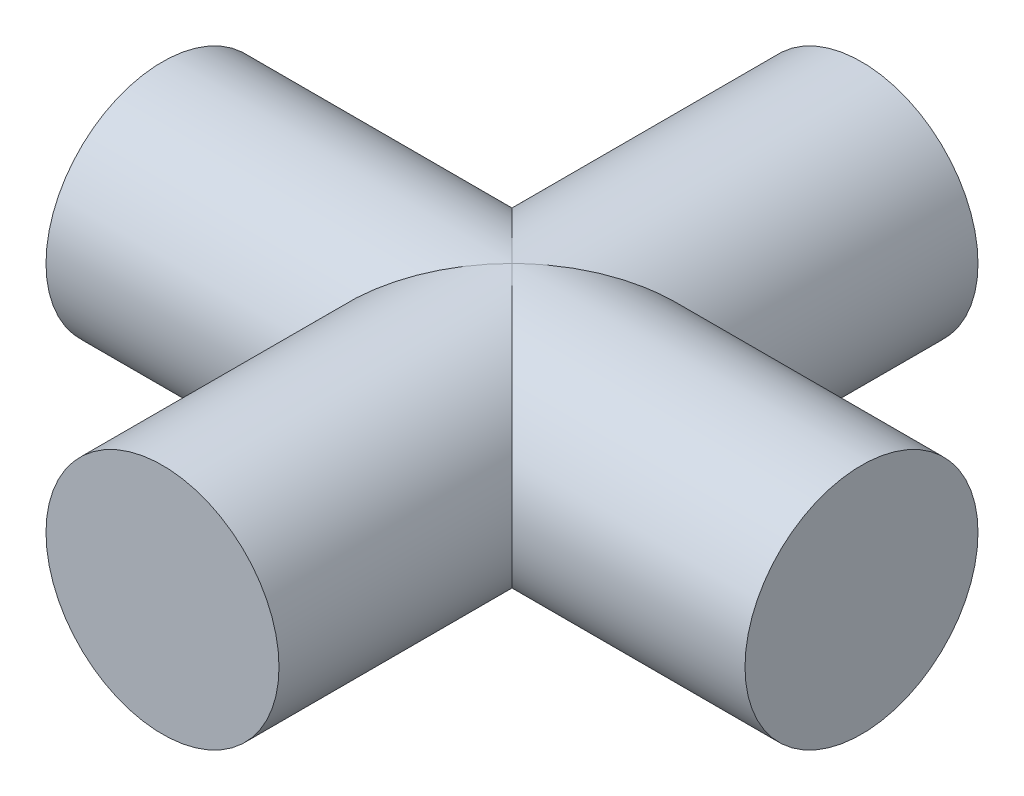
ISO-10303-21;
HEADER;
FILE_DESCRIPTION(('STEP AP214'),'2;1');
FILE_NAME('part.step','',(''),(''),'','','');
FILE_SCHEMA(('AUTOMOTIVE_DESIGN { 1 0 10303 214 1 1 1 1 }'));
ENDSEC;
DATA;
#1=APPLICATION_CONTEXT('core data for automotive mechanical design processes');
#2=APPLICATION_PROTOCOL_DEFINITION('international standard','automotive_design',2000,#1);
#3=PRODUCT_CONTEXT('',#1,'mechanical');
#4=PRODUCT('Part','Part','',(#3));
#5=PRODUCT_RELATED_PRODUCT_CATEGORY('part','',(#4));
#6=PRODUCT_DEFINITION_FORMATION('','',#4);
#7=PRODUCT_DEFINITION_CONTEXT('part definition',#1,'design');
#8=PRODUCT_DEFINITION('design','',#6,#7);
#9=PRODUCT_DEFINITION_SHAPE('','',#8);
#10=(LENGTH_UNIT() NAMED_UNIT(*) SI_UNIT(.MILLI.,.METRE.));
#11=(NAMED_UNIT(*) PLANE_ANGLE_UNIT() SI_UNIT($,.RADIAN.));
#12=(NAMED_UNIT(*) SI_UNIT($,.STERADIAN.) SOLID_ANGLE_UNIT());
#13=UNCERTAINTY_MEASURE_WITH_UNIT(LENGTH_MEASURE(1.E-05),#10,'distance_accuracy_value','');
#14=(GEOMETRIC_REPRESENTATION_CONTEXT(3) GLOBAL_UNCERTAINTY_ASSIGNED_CONTEXT((#13)) GLOBAL_UNIT_ASSIGNED_CONTEXT((#10,
#11,#12)) REPRESENTATION_CONTEXT('',''));
#15=CARTESIAN_POINT('',(0.,0.,0.));
#16=DIRECTION('',(0.,0.,1.));
#17=DIRECTION('',(1.,0.,0.));
#18=AXIS2_PLACEMENT_3D('',#15,#16,#17);
#19=CARTESIAN_POINT('',(0.,0.,-30.));
#20=DIRECTION('',(0.,0.,1.));
#21=DIRECTION('',(1.,0.,0.));
#22=AXIS2_PLACEMENT_3D('',#19,#20,#21);
#23=CYLINDRICAL_SURFACE('',#22,10.);
#24=CARTESIAN_POINT('',(0.,0.,0.));
#25=DIRECTION('',(0.707106781186547,0.,0.707106781186547));
#26=DIRECTION('',(-0.707106781186547,0.,0.707106781186547));
#27=AXIS2_PLACEMENT_3D('',#24,#25,#26);
#28=ELLIPSE('',#27,14.1421356237309,10.);
#29=CARTESIAN_POINT('',(0.,-10.,0.));
#30=VERTEX_POINT('',#29);
#31=CARTESIAN_POINT('',(0.,10.,0.));
#32=VERTEX_POINT('',#31);
#33=EDGE_CURVE('E47',#30,#32,#28,.T.);
#34=ORIENTED_EDGE('',*,*,#33,.F.);
#35=CARTESIAN_POINT('',(0.,0.,0.));
#36=DIRECTION('',(-0.707106781186547,0.,0.707106781186547));
#37=DIRECTION('',(0.707106781186547,0.,0.707106781186547));
#38=AXIS2_PLACEMENT_3D('',#35,#36,#37);
#39=ELLIPSE('',#38,14.1421356237309,10.);
#40=EDGE_CURVE('E59',#32,#30,#39,.T.);
#41=ORIENTED_EDGE('',*,*,#40,.F.);
#42=EDGE_LOOP('',(#34,#41));
#43=FACE_BOUND('',#42,.T.);
#44=CARTESIAN_POINT('',(0.,0.,-30.));
#45=DIRECTION('',(0.,0.,1.));
#46=DIRECTION('',(1.,0.,0.));
#47=AXIS2_PLACEMENT_3D('',#44,#45,#46);
#48=CIRCLE('',#47,10.);
#49=CARTESIAN_POINT('',(10.,0.,-30.));
#50=VERTEX_POINT('',#49);
#51=EDGE_CURVE('E68',#50,#50,#48,.T.);
#52=ORIENTED_EDGE('',*,*,#51,.T.);
#53=EDGE_LOOP('',(#52));
#54=FACE_BOUND('',#53,.T.);
#55=ADVANCED_FACE('F39',(#43,#54),#23,.T.);
#56=CARTESIAN_POINT('',(0.,0.,-30.));
#57=DIRECTION('',(0.,0.,1.));
#58=DIRECTION('',(1.,0.,0.));
#59=AXIS2_PLACEMENT_3D('',#56,#57,#58);
#60=PLANE('',#59);
#61=ORIENTED_EDGE('',*,*,#51,.F.);
#62=EDGE_LOOP('',(#61));
#63=FACE_BOUND('',#62,.T.);
#64=ADVANCED_FACE('F96',(#63),#60,.F.);
#65=CARTESIAN_POINT('',(30.,0.,0.));
#66=DIRECTION('',(1.,0.,0.));
#67=DIRECTION('',(0.,0.,-1.));
#68=AXIS2_PLACEMENT_3D('',#65,#66,#67);
#69=PLANE('',#68);
#70=CARTESIAN_POINT('',(30.,0.,0.));
#71=DIRECTION('',(1.,0.,0.));
#72=DIRECTION('',(0.,0.,-1.));
#73=AXIS2_PLACEMENT_3D('',#70,#71,#72);
#74=CIRCLE('',#73,10.);
#75=CARTESIAN_POINT('',(30.,0.,-10.));
#76=VERTEX_POINT('',#75);
#77=EDGE_CURVE('E83',#76,#76,#74,.T.);
#78=ORIENTED_EDGE('',*,*,#77,.T.);
#79=EDGE_LOOP('',(#78));
#80=FACE_BOUND('',#79,.T.);
#81=ADVANCED_FACE('F98',(#80),#69,.T.);
#82=CARTESIAN_POINT('',(-30.,0.,0.));
#83=DIRECTION('',(1.,0.,0.));
#84=DIRECTION('',(0.,0.,-1.));
#85=AXIS2_PLACEMENT_3D('',#82,#83,#84);
#86=CYLINDRICAL_SURFACE('',#85,10.);
#87=ORIENTED_EDGE('',*,*,#77,.F.);
#88=EDGE_LOOP('',(#87));
#89=FACE_BOUND('',#88,.T.);
#90=CARTESIAN_POINT('',(0.,0.,0.));
#91=DIRECTION('',(-0.707106781186547,0.,0.707106781186547));
#92=DIRECTION('',(0.707106781186547,0.,0.707106781186547));
#93=AXIS2_PLACEMENT_3D('',#90,#91,#92);
#94=ELLIPSE('',#93,14.1421356237309,10.);
#95=EDGE_CURVE('E53',#32,#30,#94,.F.);
#96=ORIENTED_EDGE('',*,*,#95,.T.);
#97=ORIENTED_EDGE('',*,*,#33,.T.);
#98=EDGE_LOOP('',(#96,#97));
#99=FACE_BOUND('',#98,.T.);
#100=ADVANCED_FACE('F70',(#89,#99),#86,.T.);
#101=CARTESIAN_POINT('',(0.,0.,30.));
#102=DIRECTION('',(0.,0.,1.));
#103=DIRECTION('',(1.,0.,0.));
#104=AXIS2_PLACEMENT_3D('',#101,#102,#103);
#105=PLANE('',#104);
#106=CARTESIAN_POINT('',(0.,0.,30.));
#107=DIRECTION('',(0.,0.,1.));
#108=DIRECTION('',(1.,0.,0.));
#109=AXIS2_PLACEMENT_3D('',#106,#107,#108);
#110=CIRCLE('',#109,10.);
#111=CARTESIAN_POINT('',(10.,0.,30.));
#112=VERTEX_POINT('',#111);
#113=EDGE_CURVE('E82',#112,#112,#110,.T.);
#114=ORIENTED_EDGE('',*,*,#113,.T.);
#115=EDGE_LOOP('',(#114));
#116=FACE_BOUND('',#115,.T.);
#117=ADVANCED_FACE('F106',(#116),#105,.T.);
#118=CARTESIAN_POINT('',(0.,0.,0.));
#119=DIRECTION('',(0.707106781186547,0.,0.707106781186547));
#120=DIRECTION('',(-0.707106781186547,0.,0.707106781186547));
#121=AXIS2_PLACEMENT_3D('',#118,#119,#120);
#122=ELLIPSE('',#121,14.1421356237309,10.);
#123=EDGE_CURVE('E11',#30,#32,#122,.F.);
#124=ORIENTED_EDGE('',*,*,#123,.F.);
#125=ORIENTED_EDGE('',*,*,#95,.F.);
#126=EDGE_LOOP('',(#124,#125));
#127=FACE_BOUND('',#126,.T.);
#128=ORIENTED_EDGE('',*,*,#113,.F.);
#129=EDGE_LOOP('',(#128));
#130=FACE_BOUND('',#129,.T.);
#131=ADVANCED_FACE('F65',(#127,#130),#23,.T.);
#132=ORIENTED_EDGE('',*,*,#40,.T.);
#133=ORIENTED_EDGE('',*,*,#123,.T.);
#134=EDGE_LOOP('',(#132,#133));
#135=FACE_BOUND('',#134,.T.);
#136=CARTESIAN_POINT('',(-30.,0.,0.));
#137=DIRECTION('',(1.,0.,0.));
#138=DIRECTION('',(0.,0.,-1.));
#139=AXIS2_PLACEMENT_3D('',#136,#137,#138);
#140=CIRCLE('',#139,10.);
#141=CARTESIAN_POINT('',(-30.,0.,-10.));
#142=VERTEX_POINT('',#141);
#143=EDGE_CURVE('E79',#142,#142,#140,.T.);
#144=ORIENTED_EDGE('',*,*,#143,.T.);
#145=EDGE_LOOP('',(#144));
#146=FACE_BOUND('',#145,.T.);
#147=ADVANCED_FACE('F72',(#135,#146),#86,.T.);
#148=CARTESIAN_POINT('',(-30.,0.,0.));
#149=DIRECTION('',(1.,0.,0.));
#150=DIRECTION('',(0.,0.,-1.));
#151=AXIS2_PLACEMENT_3D('',#148,#149,#150);
#152=PLANE('',#151);
#153=ORIENTED_EDGE('',*,*,#143,.F.);
#154=EDGE_LOOP('',(#153));
#155=FACE_BOUND('',#154,.T.);
#156=ADVANCED_FACE('F75',(#155),#152,.F.);
#157=CLOSED_SHELL('',(#55,#64,#81,#100,#117,#131,#147,#156));
#158=MANIFOLD_SOLID_BREP('B2',#157);
#159=ADVANCED_BREP_SHAPE_REPRESENTATION('',(#18,#158),#14);
#160=SHAPE_DEFINITION_REPRESENTATION(#9,#159);
ENDSEC;
END-ISO-10303-21;
